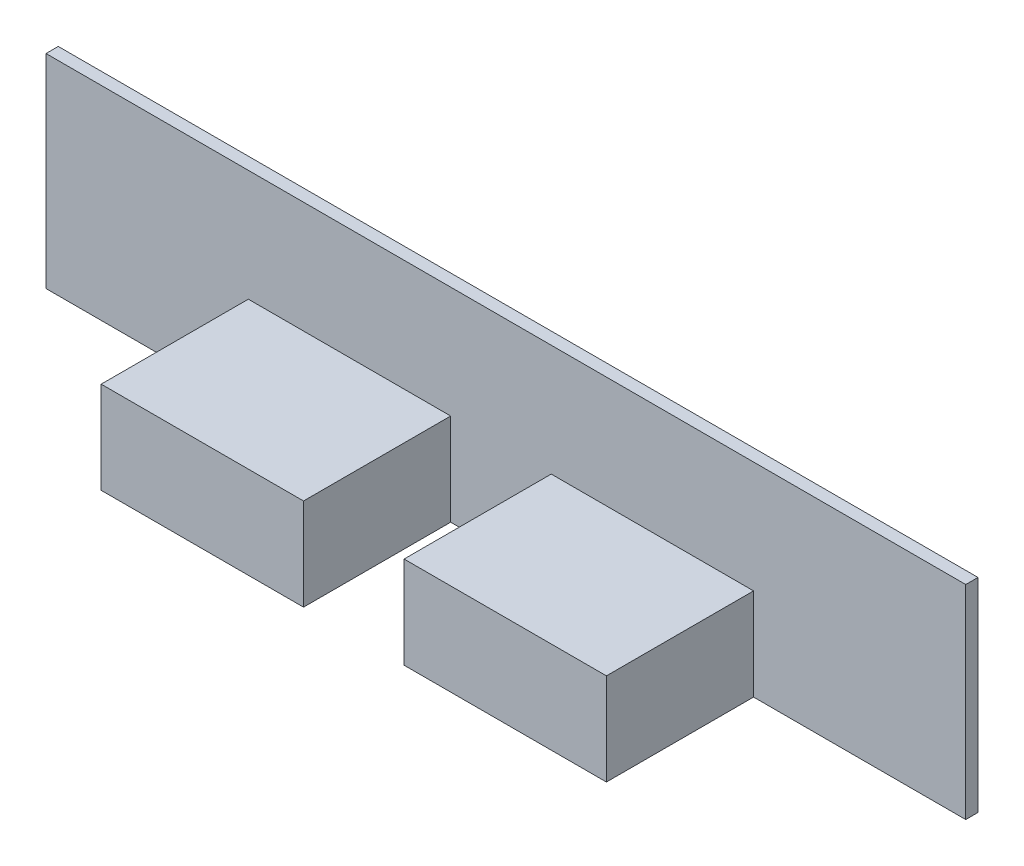
ISO-10303-21;
HEADER;
FILE_DESCRIPTION(('STEP AP214'),'2;1');
FILE_NAME('part.step','',(''),(''),'','','');
FILE_SCHEMA(('AUTOMOTIVE_DESIGN { 1 0 10303 214 1 1 1 1 }'));
ENDSEC;
DATA;
#1=APPLICATION_CONTEXT('core data for automotive mechanical design processes');
#2=APPLICATION_PROTOCOL_DEFINITION('international standard','automotive_design',2000,#1);
#3=PRODUCT_CONTEXT('',#1,'mechanical');
#4=PRODUCT('Part','Part','',(#3));
#5=PRODUCT_RELATED_PRODUCT_CATEGORY('part','',(#4));
#6=PRODUCT_DEFINITION_FORMATION('','',#4);
#7=PRODUCT_DEFINITION_CONTEXT('part definition',#1,'design');
#8=PRODUCT_DEFINITION('design','',#6,#7);
#9=PRODUCT_DEFINITION_SHAPE('','',#8);
#10=(LENGTH_UNIT() NAMED_UNIT(*) SI_UNIT(.MILLI.,.METRE.));
#11=(NAMED_UNIT(*) PLANE_ANGLE_UNIT() SI_UNIT($,.RADIAN.));
#12=(NAMED_UNIT(*) SI_UNIT($,.STERADIAN.) SOLID_ANGLE_UNIT());
#13=UNCERTAINTY_MEASURE_WITH_UNIT(LENGTH_MEASURE(1.E-05),#10,'distance_accuracy_value','');
#14=(GEOMETRIC_REPRESENTATION_CONTEXT(3) GLOBAL_UNCERTAINTY_ASSIGNED_CONTEXT((#13)) GLOBAL_UNIT_ASSIGNED_CONTEXT((#10,
#11,#12)) REPRESENTATION_CONTEXT('',''));
#15=CARTESIAN_POINT('',(0.,0.,0.));
#16=DIRECTION('',(0.,0.,1.));
#17=DIRECTION('',(1.,0.,0.));
#18=AXIS2_PLACEMENT_3D('',#15,#16,#17);
#19=CARTESIAN_POINT('',(0.,0.,0.));
#20=DIRECTION('',(0.,0.,1.));
#21=DIRECTION('',(1.,0.,0.));
#22=AXIS2_PLACEMENT_3D('',#19,#20,#21);
#23=PLANE('',#22);
#24=DIRECTION('',(1.,0.,0.));
#25=VECTOR('',#24,1.);
#26=CARTESIAN_POINT('',(0.,19.05,0.));
#27=LINE('',#26,#25);
#28=CARTESIAN_POINT('',(104.648,19.05,0.));
#29=VERTEX_POINT('',#28);
#30=CARTESIAN_POINT('',(146.558,19.05,0.));
#31=VERTEX_POINT('',#30);
#32=EDGE_CURVE('E51',#29,#31,#27,.T.);
#33=ORIENTED_EDGE('',*,*,#32,.T.);
#34=DIRECTION('',(0.,1.,0.));
#35=VECTOR('',#34,1.);
#36=CARTESIAN_POINT('',(146.558,0.,0.));
#37=LINE('',#36,#35);
#38=CARTESIAN_POINT('',(146.558,0.,0.));
#39=VERTEX_POINT('',#38);
#40=EDGE_CURVE('E230',#39,#31,#37,.T.);
#41=ORIENTED_EDGE('',*,*,#40,.F.);
#42=DIRECTION('',(1.,0.,0.));
#43=VECTOR('',#42,1.);
#44=CARTESIAN_POINT('',(0.,0.,0.));
#45=LINE('',#44,#43);
#46=CARTESIAN_POINT('',(190.5,0.,0.));
#47=VERTEX_POINT('',#46);
#48=EDGE_CURVE('E149',#39,#47,#45,.T.);
#49=ORIENTED_EDGE('',*,*,#48,.T.);
#50=DIRECTION('',(0.,1.,0.));
#51=VECTOR('',#50,1.);
#52=CARTESIAN_POINT('',(190.5,1.25401697058564E-13,0.));
#53=LINE('',#52,#51);
#54=CARTESIAN_POINT('',(190.5,42.164,0.));
#55=VERTEX_POINT('',#54);
#56=EDGE_CURVE('E202',#47,#55,#53,.T.);
#57=ORIENTED_EDGE('',*,*,#56,.T.);
#58=DIRECTION('',(1.,0.,0.));
#59=VECTOR('',#58,1.);
#60=CARTESIAN_POINT('',(0.,42.164,0.));
#61=LINE('',#60,#59);
#62=CARTESIAN_POINT('',(0.,42.164,0.));
#63=VERTEX_POINT('',#62);
#64=EDGE_CURVE('E190',#63,#55,#61,.T.);
#65=ORIENTED_EDGE('',*,*,#64,.F.);
#66=DIRECTION('',(0.,1.,0.));
#67=VECTOR('',#66,1.);
#68=CARTESIAN_POINT('',(0.,0.,0.));
#69=LINE('',#68,#67);
#70=CARTESIAN_POINT('',(0.,0.,0.));
#71=VERTEX_POINT('',#70);
#72=EDGE_CURVE('E185',#71,#63,#69,.T.);
#73=ORIENTED_EDGE('',*,*,#72,.F.);
#74=CARTESIAN_POINT('',(41.91,0.,0.));
#75=VERTEX_POINT('',#74);
#76=EDGE_CURVE('E200',#71,#75,#45,.T.);
#77=ORIENTED_EDGE('',*,*,#76,.T.);
#78=DIRECTION('',(0.,1.,0.));
#79=VECTOR('',#78,1.);
#80=CARTESIAN_POINT('',(41.91,0.,0.));
#81=LINE('',#80,#79);
#82=CARTESIAN_POINT('',(41.91,19.05,0.));
#83=VERTEX_POINT('',#82);
#84=EDGE_CURVE('E163',#75,#83,#81,.T.);
#85=ORIENTED_EDGE('',*,*,#84,.T.);
#86=DIRECTION('',(1.,0.,0.));
#87=VECTOR('',#86,1.);
#88=CARTESIAN_POINT('',(0.,19.05,0.));
#89=LINE('',#88,#87);
#90=CARTESIAN_POINT('',(83.82,19.05,0.));
#91=VERTEX_POINT('',#90);
#92=EDGE_CURVE('E153',#83,#91,#89,.T.);
#93=ORIENTED_EDGE('',*,*,#92,.T.);
#94=DIRECTION('',(0.,1.,0.));
#95=VECTOR('',#94,1.);
#96=CARTESIAN_POINT('',(83.82,0.,0.));
#97=LINE('',#96,#95);
#98=CARTESIAN_POINT('',(83.82,0.,0.));
#99=VERTEX_POINT('',#98);
#100=EDGE_CURVE('E150',#99,#91,#97,.T.);
#101=ORIENTED_EDGE('',*,*,#100,.F.);
#102=CARTESIAN_POINT('',(104.648,0.,0.));
#103=VERTEX_POINT('',#102);
#104=EDGE_CURVE('E203',#99,#103,#45,.T.);
#105=ORIENTED_EDGE('',*,*,#104,.T.);
#106=DIRECTION('',(0.,1.,0.));
#107=VECTOR('',#106,1.);
#108=CARTESIAN_POINT('',(104.648,0.,0.));
#109=LINE('',#108,#107);
#110=EDGE_CURVE('E56',#103,#29,#109,.T.);
#111=ORIENTED_EDGE('',*,*,#110,.T.);
#112=EDGE_LOOP('',(#33,#41,#49,#57,#65,#73,#77,#85,#93,#101,#105,#111));
#113=FACE_BOUND('',#112,.T.);
#114=ADVANCED_FACE('F34',(#113),#23,.T.);
#115=CARTESIAN_POINT('',(0.,0.,-2.54));
#116=DIRECTION('',(1.,0.,0.));
#117=DIRECTION('',(0.,1.,0.));
#118=AXIS2_PLACEMENT_3D('',#115,#116,#117);
#119=PLANE('',#118);
#120=ORIENTED_EDGE('',*,*,#72,.T.);
#121=DIRECTION('',(0.,0.,1.));
#122=VECTOR('',#121,1.);
#123=CARTESIAN_POINT('',(0.,42.164,-2.54));
#124=LINE('',#123,#122);
#125=CARTESIAN_POINT('',(0.,42.164,-2.54));
#126=VERTEX_POINT('',#125);
#127=EDGE_CURVE('E11',#126,#63,#124,.T.);
#128=ORIENTED_EDGE('',*,*,#127,.F.);
#129=DIRECTION('',(0.,1.,0.));
#130=VECTOR('',#129,1.);
#131=CARTESIAN_POINT('',(0.,0.,-2.54));
#132=LINE('',#131,#130);
#133=CARTESIAN_POINT('',(0.,0.,-2.54));
#134=VERTEX_POINT('',#133);
#135=EDGE_CURVE('E186',#134,#126,#132,.T.);
#136=ORIENTED_EDGE('',*,*,#135,.F.);
#137=DIRECTION('',(0.,0.,1.));
#138=VECTOR('',#137,1.);
#139=CARTESIAN_POINT('',(0.,0.,-2.54));
#140=LINE('',#139,#138);
#141=EDGE_CURVE('E38',#134,#71,#140,.T.);
#142=ORIENTED_EDGE('',*,*,#141,.T.);
#143=EDGE_LOOP('',(#120,#128,#136,#142));
#144=FACE_BOUND('',#143,.T.);
#145=ADVANCED_FACE('F36',(#144),#119,.F.);
#146=CARTESIAN_POINT('',(0.,42.164,-2.54));
#147=DIRECTION('',(0.,-1.,0.));
#148=DIRECTION('',(0.,0.,-1.));
#149=AXIS2_PLACEMENT_3D('',#146,#147,#148);
#150=PLANE('',#149);
#151=ORIENTED_EDGE('',*,*,#64,.T.);
#152=DIRECTION('',(0.,0.,1.));
#153=VECTOR('',#152,1.);
#154=CARTESIAN_POINT('',(190.5,42.164,-2.54));
#155=LINE('',#154,#153);
#156=CARTESIAN_POINT('',(190.5,42.164,-2.54));
#157=VERTEX_POINT('',#156);
#158=EDGE_CURVE('E43',#157,#55,#155,.T.);
#159=ORIENTED_EDGE('',*,*,#158,.F.);
#160=DIRECTION('',(1.,0.,0.));
#161=VECTOR('',#160,1.);
#162=CARTESIAN_POINT('',(0.,42.164,-2.54));
#163=LINE('',#162,#161);
#164=EDGE_CURVE('E196',#126,#157,#163,.T.);
#165=ORIENTED_EDGE('',*,*,#164,.F.);
#166=ORIENTED_EDGE('',*,*,#127,.T.);
#167=EDGE_LOOP('',(#151,#159,#165,#166));
#168=FACE_BOUND('',#167,.T.);
#169=ADVANCED_FACE('F255',(#168),#150,.F.);
#170=CARTESIAN_POINT('',(190.5,1.25401697058564E-13,-2.54));
#171=DIRECTION('',(1.,0.,0.));
#172=DIRECTION('',(0.,1.,0.));
#173=AXIS2_PLACEMENT_3D('',#170,#171,#172);
#174=PLANE('',#173);
#175=ORIENTED_EDGE('',*,*,#56,.F.);
#176=DIRECTION('',(0.,0.,1.));
#177=VECTOR('',#176,1.);
#178=CARTESIAN_POINT('',(190.5,0.,-2.54));
#179=LINE('',#178,#177);
#180=CARTESIAN_POINT('',(190.5,0.,-2.54));
#181=VERTEX_POINT('',#180);
#182=EDGE_CURVE('E208',#181,#47,#179,.T.);
#183=ORIENTED_EDGE('',*,*,#182,.F.);
#184=DIRECTION('',(0.,1.,0.));
#185=VECTOR('',#184,1.);
#186=CARTESIAN_POINT('',(190.5,1.25401697058564E-13,-2.54));
#187=LINE('',#186,#185);
#188=EDGE_CURVE('E193',#181,#157,#187,.T.);
#189=ORIENTED_EDGE('',*,*,#188,.T.);
#190=ORIENTED_EDGE('',*,*,#158,.T.);
#191=EDGE_LOOP('',(#175,#183,#189,#190));
#192=FACE_BOUND('',#191,.T.);
#193=ADVANCED_FACE('F262',(#192),#174,.T.);
#194=CARTESIAN_POINT('',(0.,0.,-2.54));
#195=DIRECTION('',(0.,-1.,0.));
#196=DIRECTION('',(0.,0.,-1.));
#197=AXIS2_PLACEMENT_3D('',#194,#195,#196);
#198=PLANE('',#197);
#199=ORIENTED_EDGE('',*,*,#76,.F.);
#200=ORIENTED_EDGE('',*,*,#141,.F.);
#201=DIRECTION('',(1.,0.,0.));
#202=VECTOR('',#201,1.);
#203=CARTESIAN_POINT('',(0.,0.,-2.54));
#204=LINE('',#203,#202);
#205=EDGE_CURVE('E189',#134,#181,#204,.T.);
#206=ORIENTED_EDGE('',*,*,#205,.T.);
#207=ORIENTED_EDGE('',*,*,#182,.T.);
#208=ORIENTED_EDGE('',*,*,#48,.F.);
#209=DIRECTION('',(0.,0.,-1.));
#210=VECTOR('',#209,1.);
#211=CARTESIAN_POINT('',(146.558,0.,30.48));
#212=LINE('',#211,#210);
#213=CARTESIAN_POINT('',(146.558,0.,30.48));
#214=VERTEX_POINT('',#213);
#215=EDGE_CURVE('E130',#214,#39,#212,.T.);
#216=ORIENTED_EDGE('',*,*,#215,.F.);
#217=DIRECTION('',(1.,0.,0.));
#218=VECTOR('',#217,1.);
#219=CARTESIAN_POINT('',(0.,0.,30.48));
#220=LINE('',#219,#218);
#221=CARTESIAN_POINT('',(104.648,0.,30.48));
#222=VERTEX_POINT('',#221);
#223=EDGE_CURVE('E136',#222,#214,#220,.T.);
#224=ORIENTED_EDGE('',*,*,#223,.F.);
#225=DIRECTION('',(0.,0.,-1.));
#226=VECTOR('',#225,1.);
#227=CARTESIAN_POINT('',(104.648,0.,30.48));
#228=LINE('',#227,#226);
#229=EDGE_CURVE('E229',#222,#103,#228,.T.);
#230=ORIENTED_EDGE('',*,*,#229,.T.);
#231=ORIENTED_EDGE('',*,*,#104,.F.);
#232=DIRECTION('',(0.,0.,-1.));
#233=VECTOR('',#232,1.);
#234=CARTESIAN_POINT('',(83.82,0.,30.48));
#235=LINE('',#234,#233);
#236=CARTESIAN_POINT('',(83.82,0.,30.48));
#237=VERTEX_POINT('',#236);
#238=EDGE_CURVE('E182',#237,#99,#235,.T.);
#239=ORIENTED_EDGE('',*,*,#238,.F.);
#240=DIRECTION('',(1.,0.,0.));
#241=VECTOR('',#240,1.);
#242=CARTESIAN_POINT('',(0.,0.,30.48));
#243=LINE('',#242,#241);
#244=CARTESIAN_POINT('',(41.91,0.,30.48));
#245=VERTEX_POINT('',#244);
#246=EDGE_CURVE('E159',#245,#237,#243,.T.);
#247=ORIENTED_EDGE('',*,*,#246,.F.);
#248=DIRECTION('',(0.,0.,-1.));
#249=VECTOR('',#248,1.);
#250=CARTESIAN_POINT('',(41.91,0.,30.48));
#251=LINE('',#250,#249);
#252=EDGE_CURVE('E170',#245,#75,#251,.T.);
#253=ORIENTED_EDGE('',*,*,#252,.T.);
#254=EDGE_LOOP('',(#199,#200,#206,#207,#208,#216,#224,#230,#231,#239,#247,#253));
#255=FACE_BOUND('',#254,.T.);
#256=ADVANCED_FACE('F147',(#255),#198,.T.);
#257=CARTESIAN_POINT('',(0.,0.,-2.54));
#258=DIRECTION('',(0.,0.,1.));
#259=DIRECTION('',(1.,0.,0.));
#260=AXIS2_PLACEMENT_3D('',#257,#258,#259);
#261=PLANE('',#260);
#262=ORIENTED_EDGE('',*,*,#135,.T.);
#263=ORIENTED_EDGE('',*,*,#164,.T.);
#264=ORIENTED_EDGE('',*,*,#188,.F.);
#265=ORIENTED_EDGE('',*,*,#205,.F.);
#266=EDGE_LOOP('',(#262,#263,#264,#265));
#267=FACE_BOUND('',#266,.T.);
#268=ADVANCED_FACE('F258',(#267),#261,.F.);
#269=CARTESIAN_POINT('',(83.82,0.,30.48));
#270=DIRECTION('',(-1.,0.,0.));
#271=DIRECTION('',(0.,0.,1.));
#272=AXIS2_PLACEMENT_3D('',#269,#270,#271);
#273=PLANE('',#272);
#274=ORIENTED_EDGE('',*,*,#100,.T.);
#275=DIRECTION('',(0.,0.,-1.));
#276=VECTOR('',#275,1.);
#277=CARTESIAN_POINT('',(83.82,19.05,30.48));
#278=LINE('',#277,#276);
#279=CARTESIAN_POINT('',(83.82,19.05,30.48));
#280=VERTEX_POINT('',#279);
#281=EDGE_CURVE('E179',#280,#91,#278,.T.);
#282=ORIENTED_EDGE('',*,*,#281,.F.);
#283=DIRECTION('',(0.,1.,0.));
#284=VECTOR('',#283,1.);
#285=CARTESIAN_POINT('',(83.82,0.,30.48));
#286=LINE('',#285,#284);
#287=EDGE_CURVE('E162',#237,#280,#286,.T.);
#288=ORIENTED_EDGE('',*,*,#287,.F.);
#289=ORIENTED_EDGE('',*,*,#238,.T.);
#290=EDGE_LOOP('',(#274,#282,#288,#289));
#291=FACE_BOUND('',#290,.T.);
#292=ADVANCED_FACE('F228',(#291),#273,.F.);
#293=CARTESIAN_POINT('',(0.,19.05,30.48));
#294=DIRECTION('',(0.,1.,0.));
#295=DIRECTION('',(0.,0.,1.));
#296=AXIS2_PLACEMENT_3D('',#293,#294,#295);
#297=PLANE('',#296);
#298=ORIENTED_EDGE('',*,*,#92,.F.);
#299=DIRECTION('',(0.,0.,-1.));
#300=VECTOR('',#299,1.);
#301=CARTESIAN_POINT('',(41.91,19.05,30.48));
#302=LINE('',#301,#300);
#303=CARTESIAN_POINT('',(41.91,19.05,30.48));
#304=VERTEX_POINT('',#303);
#305=EDGE_CURVE('E176',#304,#83,#302,.T.);
#306=ORIENTED_EDGE('',*,*,#305,.F.);
#307=DIRECTION('',(1.,0.,0.));
#308=VECTOR('',#307,1.);
#309=CARTESIAN_POINT('',(0.,19.05,30.48));
#310=LINE('',#309,#308);
#311=EDGE_CURVE('E165',#304,#280,#310,.T.);
#312=ORIENTED_EDGE('',*,*,#311,.T.);
#313=ORIENTED_EDGE('',*,*,#281,.T.);
#314=EDGE_LOOP('',(#298,#306,#312,#313));
#315=FACE_BOUND('',#314,.T.);
#316=ADVANCED_FACE('F225',(#315),#297,.T.);
#317=CARTESIAN_POINT('',(41.91,0.,30.48));
#318=DIRECTION('',(-1.,0.,0.));
#319=DIRECTION('',(0.,0.,1.));
#320=AXIS2_PLACEMENT_3D('',#317,#318,#319);
#321=PLANE('',#320);
#322=ORIENTED_EDGE('',*,*,#84,.F.);
#323=ORIENTED_EDGE('',*,*,#252,.F.);
#324=DIRECTION('',(0.,1.,0.));
#325=VECTOR('',#324,1.);
#326=CARTESIAN_POINT('',(41.91,0.,30.48));
#327=LINE('',#326,#325);
#328=EDGE_CURVE('E168',#245,#304,#327,.T.);
#329=ORIENTED_EDGE('',*,*,#328,.T.);
#330=ORIENTED_EDGE('',*,*,#305,.T.);
#331=EDGE_LOOP('',(#322,#323,#329,#330));
#332=FACE_BOUND('',#331,.T.);
#333=ADVANCED_FACE('F220',(#332),#321,.T.);
#334=CARTESIAN_POINT('',(0.,0.,30.48));
#335=DIRECTION('',(0.,0.,1.));
#336=DIRECTION('',(1.,0.,0.));
#337=AXIS2_PLACEMENT_3D('',#334,#335,#336);
#338=PLANE('',#337);
#339=ORIENTED_EDGE('',*,*,#246,.T.);
#340=ORIENTED_EDGE('',*,*,#287,.T.);
#341=ORIENTED_EDGE('',*,*,#311,.F.);
#342=ORIENTED_EDGE('',*,*,#328,.F.);
#343=EDGE_LOOP('',(#339,#340,#341,#342));
#344=FACE_BOUND('',#343,.T.);
#345=ADVANCED_FACE('F248',(#344),#338,.T.);
#346=CARTESIAN_POINT('',(146.558,0.,30.48));
#347=DIRECTION('',(-1.,0.,0.));
#348=DIRECTION('',(0.,0.,1.));
#349=AXIS2_PLACEMENT_3D('',#346,#347,#348);
#350=PLANE('',#349);
#351=ORIENTED_EDGE('',*,*,#40,.T.);
#352=DIRECTION('',(0.,0.,-1.));
#353=VECTOR('',#352,1.);
#354=CARTESIAN_POINT('',(146.558,19.05,30.48));
#355=LINE('',#354,#353);
#356=CARTESIAN_POINT('',(146.558,19.05,30.48));
#357=VERTEX_POINT('',#356);
#358=EDGE_CURVE('E131',#357,#31,#355,.T.);
#359=ORIENTED_EDGE('',*,*,#358,.F.);
#360=DIRECTION('',(0.,1.,0.));
#361=VECTOR('',#360,1.);
#362=CARTESIAN_POINT('',(146.558,0.,30.48));
#363=LINE('',#362,#361);
#364=EDGE_CURVE('E125',#214,#357,#363,.T.);
#365=ORIENTED_EDGE('',*,*,#364,.F.);
#366=ORIENTED_EDGE('',*,*,#215,.T.);
#367=EDGE_LOOP('',(#351,#359,#365,#366));
#368=FACE_BOUND('',#367,.T.);
#369=ADVANCED_FACE('F128',(#368),#350,.F.);
#370=CARTESIAN_POINT('',(0.,19.05,30.48));
#371=DIRECTION('',(0.,1.,0.));
#372=DIRECTION('',(0.,0.,1.));
#373=AXIS2_PLACEMENT_3D('',#370,#371,#372);
#374=PLANE('',#373);
#375=ORIENTED_EDGE('',*,*,#32,.F.);
#376=DIRECTION('',(0.,0.,-1.));
#377=VECTOR('',#376,1.);
#378=CARTESIAN_POINT('',(104.648,19.05,30.48));
#379=LINE('',#378,#377);
#380=CARTESIAN_POINT('',(104.648,19.05,30.48));
#381=VERTEX_POINT('',#380);
#382=EDGE_CURVE('E155',#381,#29,#379,.T.);
#383=ORIENTED_EDGE('',*,*,#382,.F.);
#384=DIRECTION('',(1.,0.,0.));
#385=VECTOR('',#384,1.);
#386=CARTESIAN_POINT('',(0.,19.05,30.48));
#387=LINE('',#386,#385);
#388=EDGE_CURVE('E135',#381,#357,#387,.T.);
#389=ORIENTED_EDGE('',*,*,#388,.T.);
#390=ORIENTED_EDGE('',*,*,#358,.T.);
#391=EDGE_LOOP('',(#375,#383,#389,#390));
#392=FACE_BOUND('',#391,.T.);
#393=ADVANCED_FACE('F240',(#392),#374,.T.);
#394=CARTESIAN_POINT('',(104.648,0.,30.48));
#395=DIRECTION('',(-1.,0.,0.));
#396=DIRECTION('',(0.,0.,1.));
#397=AXIS2_PLACEMENT_3D('',#394,#395,#396);
#398=PLANE('',#397);
#399=ORIENTED_EDGE('',*,*,#110,.F.);
#400=ORIENTED_EDGE('',*,*,#229,.F.);
#401=DIRECTION('',(0.,1.,0.));
#402=VECTOR('',#401,1.);
#403=CARTESIAN_POINT('',(104.648,0.,30.48));
#404=LINE('',#403,#402);
#405=EDGE_CURVE('E142',#222,#381,#404,.T.);
#406=ORIENTED_EDGE('',*,*,#405,.T.);
#407=ORIENTED_EDGE('',*,*,#382,.T.);
#408=EDGE_LOOP('',(#399,#400,#406,#407));
#409=FACE_BOUND('',#408,.T.);
#410=ADVANCED_FACE('F238',(#409),#398,.T.);
#411=CARTESIAN_POINT('',(0.,0.,30.48));
#412=DIRECTION('',(0.,0.,1.));
#413=DIRECTION('',(1.,0.,0.));
#414=AXIS2_PLACEMENT_3D('',#411,#412,#413);
#415=PLANE('',#414);
#416=ORIENTED_EDGE('',*,*,#223,.T.);
#417=ORIENTED_EDGE('',*,*,#364,.T.);
#418=ORIENTED_EDGE('',*,*,#388,.F.);
#419=ORIENTED_EDGE('',*,*,#405,.F.);
#420=EDGE_LOOP('',(#416,#417,#418,#419));
#421=FACE_BOUND('',#420,.T.);
#422=ADVANCED_FACE('F140',(#421),#415,.T.);
#423=CLOSED_SHELL('',(#114,#145,#169,#193,#256,#268,#292,#316,#333,#345,#369,#393,#410,#422));
#424=MANIFOLD_SOLID_BREP('B2',#423);
#425=ADVANCED_BREP_SHAPE_REPRESENTATION('',(#18,#424),#14);
#426=SHAPE_DEFINITION_REPRESENTATION(#9,#425);
ENDSEC;
END-ISO-10303-21;
